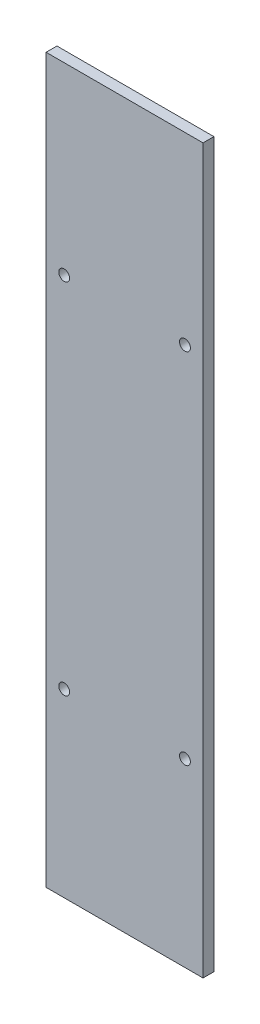
ISO-10303-21;
HEADER;
FILE_DESCRIPTION(('STEP AP214'),'2;1');
FILE_NAME('part.step','',(''),(''),'','','');
FILE_SCHEMA(('AUTOMOTIVE_DESIGN { 1 0 10303 214 1 1 1 1 }'));
ENDSEC;
DATA;
#1=APPLICATION_CONTEXT('core data for automotive mechanical design processes');
#2=APPLICATION_PROTOCOL_DEFINITION('international standard','automotive_design',2000,#1);
#3=PRODUCT_CONTEXT('',#1,'mechanical');
#4=PRODUCT('Part','Part','',(#3));
#5=PRODUCT_RELATED_PRODUCT_CATEGORY('part','',(#4));
#6=PRODUCT_DEFINITION_FORMATION('','',#4);
#7=PRODUCT_DEFINITION_CONTEXT('part definition',#1,'design');
#8=PRODUCT_DEFINITION('design','',#6,#7);
#9=PRODUCT_DEFINITION_SHAPE('','',#8);
#10=(LENGTH_UNIT() NAMED_UNIT(*) SI_UNIT(.MILLI.,.METRE.));
#11=(NAMED_UNIT(*) PLANE_ANGLE_UNIT() SI_UNIT($,.RADIAN.));
#12=(NAMED_UNIT(*) SI_UNIT($,.STERADIAN.) SOLID_ANGLE_UNIT());
#13=UNCERTAINTY_MEASURE_WITH_UNIT(LENGTH_MEASURE(1.E-05),#10,'distance_accuracy_value','');
#14=(GEOMETRIC_REPRESENTATION_CONTEXT(3) GLOBAL_UNCERTAINTY_ASSIGNED_CONTEXT((#13)) GLOBAL_UNIT_ASSIGNED_CONTEXT((#10,
#11,#12)) REPRESENTATION_CONTEXT('',''));
#15=CARTESIAN_POINT('',(0.,0.,0.));
#16=DIRECTION('',(0.,0.,1.));
#17=DIRECTION('',(1.,0.,0.));
#18=AXIS2_PLACEMENT_3D('',#15,#16,#17);
#19=CARTESIAN_POINT('',(0.,0.,3.));
#20=DIRECTION('',(0.,0.,-1.));
#21=DIRECTION('',(-1.,0.,0.));
#22=AXIS2_PLACEMENT_3D('',#19,#20,#21);
#23=PLANE('',#22);
#24=DIRECTION('',(0.,-1.,0.));
#25=VECTOR('',#24,1.);
#26=CARTESIAN_POINT('',(-21.7,100.442700745,3.));
#27=LINE('',#26,#25);
#28=CARTESIAN_POINT('',(-21.7,100.442700745,3.));
#29=VERTEX_POINT('',#28);
#30=CARTESIAN_POINT('',(-21.7,-99.557299255,3.));
#31=VERTEX_POINT('',#30);
#32=EDGE_CURVE('E85',#29,#31,#27,.T.);
#33=ORIENTED_EDGE('',*,*,#32,.T.);
#34=DIRECTION('',(1.,0.,0.));
#35=VECTOR('',#34,1.);
#36=CARTESIAN_POINT('',(21.7,-99.557299255,3.));
#37=LINE('',#36,#35);
#38=CARTESIAN_POINT('',(21.7,-99.557299255,3.));
#39=VERTEX_POINT('',#38);
#40=EDGE_CURVE('E80',#31,#39,#37,.T.);
#41=ORIENTED_EDGE('',*,*,#40,.T.);
#42=DIRECTION('',(0.,1.,0.));
#43=VECTOR('',#42,1.);
#44=CARTESIAN_POINT('',(21.7,100.442700745,3.));
#45=LINE('',#44,#43);
#46=CARTESIAN_POINT('',(21.7,100.442700745,3.));
#47=VERTEX_POINT('',#46);
#48=EDGE_CURVE('E83',#39,#47,#45,.T.);
#49=ORIENTED_EDGE('',*,*,#48,.T.);
#50=DIRECTION('',(-1.,0.,0.));
#51=VECTOR('',#50,1.);
#52=CARTESIAN_POINT('',(21.7,100.442700745,3.));
#53=LINE('',#52,#51);
#54=EDGE_CURVE('E50',#47,#29,#53,.T.);
#55=ORIENTED_EDGE('',*,*,#54,.T.);
#56=EDGE_LOOP('',(#33,#41,#49,#55));
#57=FACE_BOUND('',#56,.T.);
#58=CARTESIAN_POINT('',(-16.7,49.557299255,3.));
#59=DIRECTION('',(0.,0.,1.));
#60=DIRECTION('',(1.,0.,0.));
#61=AXIS2_PLACEMENT_3D('',#58,#59,#60);
#62=CIRCLE('',#61,1.5);
#63=CARTESIAN_POINT('',(-15.2,49.557299255,3.));
#64=VERTEX_POINT('',#63);
#65=EDGE_CURVE('E100',#64,#64,#62,.T.);
#66=ORIENTED_EDGE('',*,*,#65,.F.);
#67=EDGE_LOOP('',(#66));
#68=FACE_BOUND('',#67,.T.);
#69=CARTESIAN_POINT('',(-16.7,-49.557299255,3.));
#70=DIRECTION('',(0.,0.,1.));
#71=DIRECTION('',(1.,0.,0.));
#72=AXIS2_PLACEMENT_3D('',#69,#70,#71);
#73=CIRCLE('',#72,1.5);
#74=CARTESIAN_POINT('',(-15.2,-49.557299255,3.));
#75=VERTEX_POINT('',#74);
#76=EDGE_CURVE('E115',#75,#75,#73,.T.);
#77=ORIENTED_EDGE('',*,*,#76,.F.);
#78=EDGE_LOOP('',(#77));
#79=FACE_BOUND('',#78,.T.);
#80=CARTESIAN_POINT('',(16.7,-49.557299255,3.));
#81=DIRECTION('',(0.,0.,1.));
#82=DIRECTION('',(1.,0.,0.));
#83=AXIS2_PLACEMENT_3D('',#80,#81,#82);
#84=CIRCLE('',#83,1.5);
#85=CARTESIAN_POINT('',(18.2,-49.557299255,3.));
#86=VERTEX_POINT('',#85);
#87=EDGE_CURVE('E121',#86,#86,#84,.T.);
#88=ORIENTED_EDGE('',*,*,#87,.F.);
#89=EDGE_LOOP('',(#88));
#90=FACE_BOUND('',#89,.T.);
#91=CARTESIAN_POINT('',(16.7,49.557299255,3.));
#92=DIRECTION('',(0.,0.,1.));
#93=DIRECTION('',(1.,0.,0.));
#94=AXIS2_PLACEMENT_3D('',#91,#92,#93);
#95=CIRCLE('',#94,1.5);
#96=CARTESIAN_POINT('',(18.2,49.557299255,3.));
#97=VERTEX_POINT('',#96);
#98=EDGE_CURVE('E127',#97,#97,#95,.T.);
#99=ORIENTED_EDGE('',*,*,#98,.F.);
#100=EDGE_LOOP('',(#99));
#101=FACE_BOUND('',#100,.T.);
#102=ADVANCED_FACE('F33',(#57,#68,#79,#90,#101),#23,.F.);
#103=CARTESIAN_POINT('',(0.,0.,0.));
#104=DIRECTION('',(0.,0.,-1.));
#105=DIRECTION('',(-1.,0.,0.));
#106=AXIS2_PLACEMENT_3D('',#103,#104,#105);
#107=PLANE('',#106);
#108=CARTESIAN_POINT('',(16.7,-49.557299255,0.));
#109=DIRECTION('',(0.,0.,1.));
#110=DIRECTION('',(1.,0.,0.));
#111=AXIS2_PLACEMENT_3D('',#108,#109,#110);
#112=CIRCLE('',#111,1.5);
#113=CARTESIAN_POINT('',(18.2,-49.557299255,0.));
#114=VERTEX_POINT('',#113);
#115=EDGE_CURVE('E124',#114,#114,#112,.T.);
#116=ORIENTED_EDGE('',*,*,#115,.T.);
#117=EDGE_LOOP('',(#116));
#118=FACE_BOUND('',#117,.T.);
#119=CARTESIAN_POINT('',(-16.7,49.557299255,0.));
#120=DIRECTION('',(0.,0.,1.));
#121=DIRECTION('',(1.,0.,0.));
#122=AXIS2_PLACEMENT_3D('',#119,#120,#121);
#123=CIRCLE('',#122,1.5);
#124=CARTESIAN_POINT('',(-15.2,49.557299255,0.));
#125=VERTEX_POINT('',#124);
#126=EDGE_CURVE('E112',#125,#125,#123,.T.);
#127=ORIENTED_EDGE('',*,*,#126,.T.);
#128=EDGE_LOOP('',(#127));
#129=FACE_BOUND('',#128,.T.);
#130=DIRECTION('',(0.,-1.,0.));
#131=VECTOR('',#130,1.);
#132=CARTESIAN_POINT('',(-21.7,100.442700745,0.));
#133=LINE('',#132,#131);
#134=CARTESIAN_POINT('',(-21.7,100.442700745,0.));
#135=VERTEX_POINT('',#134);
#136=CARTESIAN_POINT('',(-21.7,-99.557299255,0.));
#137=VERTEX_POINT('',#136);
#138=EDGE_CURVE('E97',#135,#137,#133,.T.);
#139=ORIENTED_EDGE('',*,*,#138,.F.);
#140=DIRECTION('',(-1.,0.,0.));
#141=VECTOR('',#140,1.);
#142=CARTESIAN_POINT('',(21.7,100.442700745,0.));
#143=LINE('',#142,#141);
#144=CARTESIAN_POINT('',(21.7,100.442700745,0.));
#145=VERTEX_POINT('',#144);
#146=EDGE_CURVE('E73',#145,#135,#143,.T.);
#147=ORIENTED_EDGE('',*,*,#146,.F.);
#148=DIRECTION('',(0.,1.,0.));
#149=VECTOR('',#148,1.);
#150=CARTESIAN_POINT('',(21.7,100.442700745,0.));
#151=LINE('',#150,#149);
#152=CARTESIAN_POINT('',(21.7,-99.557299255,0.));
#153=VERTEX_POINT('',#152);
#154=EDGE_CURVE('E67',#153,#145,#151,.T.);
#155=ORIENTED_EDGE('',*,*,#154,.F.);
#156=DIRECTION('',(1.,0.,0.));
#157=VECTOR('',#156,1.);
#158=CARTESIAN_POINT('',(21.7,-99.557299255,0.));
#159=LINE('',#158,#157);
#160=EDGE_CURVE('E89',#137,#153,#159,.T.);
#161=ORIENTED_EDGE('',*,*,#160,.F.);
#162=EDGE_LOOP('',(#139,#147,#155,#161));
#163=FACE_BOUND('',#162,.T.);
#164=CARTESIAN_POINT('',(-16.7,-49.557299255,0.));
#165=DIRECTION('',(0.,0.,1.));
#166=DIRECTION('',(1.,0.,0.));
#167=AXIS2_PLACEMENT_3D('',#164,#165,#166);
#168=CIRCLE('',#167,1.5);
#169=CARTESIAN_POINT('',(-15.2,-49.557299255,0.));
#170=VERTEX_POINT('',#169);
#171=EDGE_CURVE('E118',#170,#170,#168,.T.);
#172=ORIENTED_EDGE('',*,*,#171,.T.);
#173=EDGE_LOOP('',(#172));
#174=FACE_BOUND('',#173,.T.);
#175=CARTESIAN_POINT('',(16.7,49.557299255,0.));
#176=DIRECTION('',(0.,0.,1.));
#177=DIRECTION('',(1.,0.,0.));
#178=AXIS2_PLACEMENT_3D('',#175,#176,#177);
#179=CIRCLE('',#178,1.5);
#180=CARTESIAN_POINT('',(18.2,49.557299255,0.));
#181=VERTEX_POINT('',#180);
#182=EDGE_CURVE('E130',#181,#181,#179,.T.);
#183=ORIENTED_EDGE('',*,*,#182,.T.);
#184=EDGE_LOOP('',(#183));
#185=FACE_BOUND('',#184,.T.);
#186=ADVANCED_FACE('F108',(#118,#129,#163,#174,#185),#107,.T.);
#187=CARTESIAN_POINT('',(-21.7,100.442700745,3.));
#188=DIRECTION('',(1.,0.,0.));
#189=DIRECTION('',(0.,0.,-1.));
#190=AXIS2_PLACEMENT_3D('',#187,#188,#189);
#191=PLANE('',#190);
#192=ORIENTED_EDGE('',*,*,#138,.T.);
#193=DIRECTION('',(0.,0.,-1.));
#194=VECTOR('',#193,1.);
#195=CARTESIAN_POINT('',(-21.7,-99.557299255,3.));
#196=LINE('',#195,#194);
#197=EDGE_CURVE('E11',#31,#137,#196,.T.);
#198=ORIENTED_EDGE('',*,*,#197,.F.);
#199=ORIENTED_EDGE('',*,*,#32,.F.);
#200=DIRECTION('',(0.,0.,-1.));
#201=VECTOR('',#200,1.);
#202=CARTESIAN_POINT('',(-21.7,100.442700745,3.));
#203=LINE('',#202,#201);
#204=EDGE_CURVE('E93',#29,#135,#203,.T.);
#205=ORIENTED_EDGE('',*,*,#204,.T.);
#206=EDGE_LOOP('',(#192,#198,#199,#205));
#207=FACE_BOUND('',#206,.T.);
#208=ADVANCED_FACE('F35',(#207),#191,.F.);
#209=CARTESIAN_POINT('',(21.7,-99.557299255,3.));
#210=DIRECTION('',(0.,1.,0.));
#211=DIRECTION('',(0.,0.,1.));
#212=AXIS2_PLACEMENT_3D('',#209,#210,#211);
#213=PLANE('',#212);
#214=ORIENTED_EDGE('',*,*,#160,.T.);
#215=DIRECTION('',(0.,0.,-1.));
#216=VECTOR('',#215,1.);
#217=CARTESIAN_POINT('',(21.7,-99.557299255,3.));
#218=LINE('',#217,#216);
#219=EDGE_CURVE('E42',#39,#153,#218,.T.);
#220=ORIENTED_EDGE('',*,*,#219,.F.);
#221=ORIENTED_EDGE('',*,*,#40,.F.);
#222=ORIENTED_EDGE('',*,*,#197,.T.);
#223=EDGE_LOOP('',(#214,#220,#221,#222));
#224=FACE_BOUND('',#223,.T.);
#225=ADVANCED_FACE('F88',(#224),#213,.F.);
#226=CARTESIAN_POINT('',(21.7,100.442700745,3.));
#227=DIRECTION('',(-1.,0.,0.));
#228=DIRECTION('',(0.,0.,1.));
#229=AXIS2_PLACEMENT_3D('',#226,#227,#228);
#230=PLANE('',#229);
#231=ORIENTED_EDGE('',*,*,#154,.T.);
#232=DIRECTION('',(0.,0.,-1.));
#233=VECTOR('',#232,1.);
#234=CARTESIAN_POINT('',(21.7,100.442700745,3.));
#235=LINE('',#234,#233);
#236=EDGE_CURVE('E90',#47,#145,#235,.T.);
#237=ORIENTED_EDGE('',*,*,#236,.F.);
#238=ORIENTED_EDGE('',*,*,#48,.F.);
#239=ORIENTED_EDGE('',*,*,#219,.T.);
#240=EDGE_LOOP('',(#231,#237,#238,#239));
#241=FACE_BOUND('',#240,.T.);
#242=ADVANCED_FACE('F91',(#241),#230,.F.);
#243=CARTESIAN_POINT('',(21.7,100.442700745,3.));
#244=DIRECTION('',(0.,-1.,0.));
#245=DIRECTION('',(0.,0.,-1.));
#246=AXIS2_PLACEMENT_3D('',#243,#244,#245);
#247=PLANE('',#246);
#248=ORIENTED_EDGE('',*,*,#146,.T.);
#249=ORIENTED_EDGE('',*,*,#204,.F.);
#250=ORIENTED_EDGE('',*,*,#54,.F.);
#251=ORIENTED_EDGE('',*,*,#236,.T.);
#252=EDGE_LOOP('',(#248,#249,#250,#251));
#253=FACE_BOUND('',#252,.T.);
#254=ADVANCED_FACE('F105',(#253),#247,.F.);
#255=CARTESIAN_POINT('',(-16.7,49.557299255,3.));
#256=DIRECTION('',(0.,0.,-1.));
#257=DIRECTION('',(-1.,0.,0.));
#258=AXIS2_PLACEMENT_3D('',#255,#256,#257);
#259=CYLINDRICAL_SURFACE('',#258,1.5);
#260=ORIENTED_EDGE('',*,*,#65,.T.);
#261=EDGE_LOOP('',(#260));
#262=FACE_BOUND('',#261,.T.);
#263=ORIENTED_EDGE('',*,*,#126,.F.);
#264=EDGE_LOOP('',(#263));
#265=FACE_BOUND('',#264,.T.);
#266=ADVANCED_FACE('F147',(#262,#265),#259,.F.);
#267=CARTESIAN_POINT('',(-16.7,-49.557299255,3.));
#268=DIRECTION('',(0.,0.,-1.));
#269=DIRECTION('',(-1.,0.,0.));
#270=AXIS2_PLACEMENT_3D('',#267,#268,#269);
#271=CYLINDRICAL_SURFACE('',#270,1.5);
#272=ORIENTED_EDGE('',*,*,#76,.T.);
#273=EDGE_LOOP('',(#272));
#274=FACE_BOUND('',#273,.T.);
#275=ORIENTED_EDGE('',*,*,#171,.F.);
#276=EDGE_LOOP('',(#275));
#277=FACE_BOUND('',#276,.T.);
#278=ADVANCED_FACE('F193',(#274,#277),#271,.F.);
#279=CARTESIAN_POINT('',(16.7,-49.557299255,3.));
#280=DIRECTION('',(0.,0.,-1.));
#281=DIRECTION('',(-1.,0.,0.));
#282=AXIS2_PLACEMENT_3D('',#279,#280,#281);
#283=CYLINDRICAL_SURFACE('',#282,1.5);
#284=ORIENTED_EDGE('',*,*,#87,.T.);
#285=EDGE_LOOP('',(#284));
#286=FACE_BOUND('',#285,.T.);
#287=ORIENTED_EDGE('',*,*,#115,.F.);
#288=EDGE_LOOP('',(#287));
#289=FACE_BOUND('',#288,.T.);
#290=ADVANCED_FACE('F201',(#286,#289),#283,.F.);
#291=CARTESIAN_POINT('',(16.7,49.557299255,3.));
#292=DIRECTION('',(0.,0.,-1.));
#293=DIRECTION('',(-1.,0.,0.));
#294=AXIS2_PLACEMENT_3D('',#291,#292,#293);
#295=CYLINDRICAL_SURFACE('',#294,1.5);
#296=ORIENTED_EDGE('',*,*,#98,.T.);
#297=EDGE_LOOP('',(#296));
#298=FACE_BOUND('',#297,.T.);
#299=ORIENTED_EDGE('',*,*,#182,.F.);
#300=EDGE_LOOP('',(#299));
#301=FACE_BOUND('',#300,.T.);
#302=ADVANCED_FACE('F136',(#298,#301),#295,.F.);
#303=CLOSED_SHELL('',(#102,#186,#208,#225,#242,#254,#266,#278,#290,#302));
#304=MANIFOLD_SOLID_BREP('B2',#303);
#305=ADVANCED_BREP_SHAPE_REPRESENTATION('',(#18,#304),#14);
#306=SHAPE_DEFINITION_REPRESENTATION(#9,#305);
ENDSEC;
END-ISO-10303-21;
